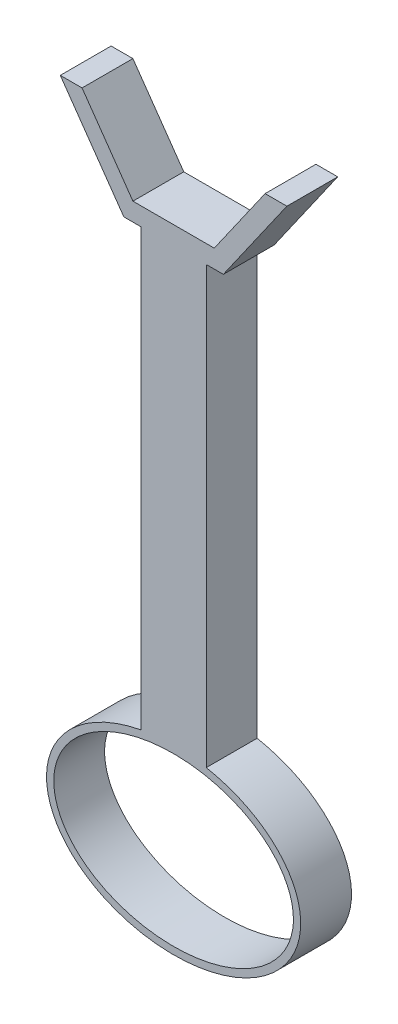
ISO-10303-21;
HEADER;
FILE_DESCRIPTION(('STEP AP214'),'2;1');
FILE_NAME('part.step','',(''),(''),'','','');
FILE_SCHEMA(('AUTOMOTIVE_DESIGN { 1 0 10303 214 1 1 1 1 }'));
ENDSEC;
DATA;
#1=APPLICATION_CONTEXT('core data for automotive mechanical design processes');
#2=APPLICATION_PROTOCOL_DEFINITION('international standard','automotive_design',2000,#1);
#3=PRODUCT_CONTEXT('',#1,'mechanical');
#4=PRODUCT('Part','Part','',(#3));
#5=PRODUCT_RELATED_PRODUCT_CATEGORY('part','',(#4));
#6=PRODUCT_DEFINITION_FORMATION('','',#4);
#7=PRODUCT_DEFINITION_CONTEXT('part definition',#1,'design');
#8=PRODUCT_DEFINITION('design','',#6,#7);
#9=PRODUCT_DEFINITION_SHAPE('','',#8);
#10=(LENGTH_UNIT() NAMED_UNIT(*) SI_UNIT(.MILLI.,.METRE.));
#11=(NAMED_UNIT(*) PLANE_ANGLE_UNIT() SI_UNIT($,.RADIAN.));
#12=(NAMED_UNIT(*) SI_UNIT($,.STERADIAN.) SOLID_ANGLE_UNIT());
#13=UNCERTAINTY_MEASURE_WITH_UNIT(LENGTH_MEASURE(1.E-05),#10,'distance_accuracy_value','');
#14=(GEOMETRIC_REPRESENTATION_CONTEXT(3) GLOBAL_UNCERTAINTY_ASSIGNED_CONTEXT((#13)) GLOBAL_UNIT_ASSIGNED_CONTEXT((#10,
#11,#12)) REPRESENTATION_CONTEXT('',''));
#15=CARTESIAN_POINT('',(0.,0.,0.));
#16=DIRECTION('',(0.,0.,1.));
#17=DIRECTION('',(1.,0.,0.));
#18=AXIS2_PLACEMENT_3D('',#15,#16,#17);
#19=CARTESIAN_POINT('',(-10.2239295190365,0.,7.));
#20=DIRECTION('',(1.,0.,0.));
#21=DIRECTION('',(0.,0.,-1.));
#22=AXIS2_PLACEMENT_3D('',#19,#20,#21);
#23=PLANE('',#22);
#24=DIRECTION('',(0.,-1.,0.));
#25=VECTOR('',#24,1.);
#26=CARTESIAN_POINT('',(-10.2239295190365,0.,0.));
#27=LINE('',#26,#25);
#28=CARTESIAN_POINT('',(-10.2239295190365,11.8416238441167,0.));
#29=VERTEX_POINT('',#28);
#30=CARTESIAN_POINT('',(-10.2239295190365,-48.1583761558833,0.));
#31=VERTEX_POINT('',#30);
#32=EDGE_CURVE('E161',#29,#31,#27,.T.);
#33=ORIENTED_EDGE('',*,*,#32,.T.);
#34=DIRECTION('',(0.,0.,-1.));
#35=VECTOR('',#34,1.);
#36=CARTESIAN_POINT('',(-10.2239295190365,-48.1583761558833,7.));
#37=LINE('',#36,#35);
#38=CARTESIAN_POINT('',(-10.2239295190365,-48.1583761558833,7.));
#39=VERTEX_POINT('',#38);
#40=EDGE_CURVE('E11',#39,#31,#37,.T.);
#41=ORIENTED_EDGE('',*,*,#40,.F.);
#42=DIRECTION('',(0.,-1.,0.));
#43=VECTOR('',#42,1.);
#44=CARTESIAN_POINT('',(-10.2239295190365,0.,7.));
#45=LINE('',#44,#43);
#46=CARTESIAN_POINT('',(-10.2239295190365,11.8416238441167,7.));
#47=VERTEX_POINT('',#46);
#48=EDGE_CURVE('E209',#47,#39,#45,.T.);
#49=ORIENTED_EDGE('',*,*,#48,.F.);
#50=DIRECTION('',(0.,0.,-1.));
#51=VECTOR('',#50,1.);
#52=CARTESIAN_POINT('',(-10.2239295190365,11.8416238441167,7.));
#53=LINE('',#52,#51);
#54=EDGE_CURVE('E49',#47,#29,#53,.T.);
#55=ORIENTED_EDGE('',*,*,#54,.T.);
#56=EDGE_LOOP('',(#33,#41,#49,#55));
#57=FACE_BOUND('',#56,.T.);
#58=ADVANCED_FACE('F33',(#57),#23,.F.);
#59=CARTESIAN_POINT('',(-5.72392951903651,-60.238043673946,7.));
#60=DIRECTION('',(0.,0.,1.));
#61=DIRECTION('',(-1.,0.,0.));
#62=AXIS2_PLACEMENT_3D('',#59,#60,#61);
#63=ELLIPSE('',#62,17.5,12.5);
#64=DIRECTION('',(0.,0.,-1.));
#65=VECTOR('',#64,1.);
#66=SURFACE_OF_LINEAR_EXTRUSION('',#63,#65);
#67=CARTESIAN_POINT('',(-5.72392951903651,-60.238043673946,0.));
#68=DIRECTION('',(0.,0.,1.));
#69=DIRECTION('',(-1.,0.,0.));
#70=AXIS2_PLACEMENT_3D('',#67,#68,#69);
#71=ELLIPSE('',#70,17.5,12.5);
#72=CARTESIAN_POINT('',(-1.22392951903651,-48.1583761558833,0.));
#73=VERTEX_POINT('',#72);
#74=EDGE_CURVE('E254',#31,#73,#71,.T.);
#75=ORIENTED_EDGE('',*,*,#74,.T.);
#76=DIRECTION('',(0.,0.,-1.));
#77=VECTOR('',#76,1.);
#78=CARTESIAN_POINT('',(-1.22392951903651,-48.1583761558833,7.));
#79=LINE('',#78,#77);
#80=CARTESIAN_POINT('',(-1.22392951903651,-48.1583761558833,7.));
#81=VERTEX_POINT('',#80);
#82=EDGE_CURVE('E41',#81,#73,#79,.T.);
#83=ORIENTED_EDGE('',*,*,#82,.F.);
#84=EDGE_CURVE('E99',#39,#81,#63,.T.);
#85=ORIENTED_EDGE('',*,*,#84,.F.);
#86=ORIENTED_EDGE('',*,*,#40,.T.);
#87=EDGE_LOOP('',(#75,#83,#85,#86));
#88=FACE_BOUND('',#87,.T.);
#89=ADVANCED_FACE('F201',(#88),#66,.F.);
#90=CARTESIAN_POINT('',(-1.22392951903651,0.,7.));
#91=DIRECTION('',(-1.,0.,0.));
#92=DIRECTION('',(0.,0.,1.));
#93=AXIS2_PLACEMENT_3D('',#90,#91,#92);
#94=PLANE('',#93);
#95=DIRECTION('',(0.,1.,0.));
#96=VECTOR('',#95,1.);
#97=CARTESIAN_POINT('',(-1.22392951903651,0.,0.));
#98=LINE('',#97,#96);
#99=CARTESIAN_POINT('',(-1.22392951903651,11.8416238441167,0.));
#100=VERTEX_POINT('',#99);
#101=EDGE_CURVE('E250',#73,#100,#98,.T.);
#102=ORIENTED_EDGE('',*,*,#101,.T.);
#103=DIRECTION('',(0.,0.,-1.));
#104=VECTOR('',#103,1.);
#105=CARTESIAN_POINT('',(-1.22392951903651,11.8416238441167,7.));
#106=LINE('',#105,#104);
#107=CARTESIAN_POINT('',(-1.22392951903651,11.8416238441167,7.));
#108=VERTEX_POINT('',#107);
#109=EDGE_CURVE('E244',#108,#100,#106,.T.);
#110=ORIENTED_EDGE('',*,*,#109,.F.);
#111=DIRECTION('',(0.,1.,0.));
#112=VECTOR('',#111,1.);
#113=CARTESIAN_POINT('',(-1.22392951903651,0.,7.));
#114=LINE('',#113,#112);
#115=EDGE_CURVE('E208',#81,#108,#114,.T.);
#116=ORIENTED_EDGE('',*,*,#115,.F.);
#117=ORIENTED_EDGE('',*,*,#82,.T.);
#118=EDGE_LOOP('',(#102,#110,#116,#117));
#119=FACE_BOUND('',#118,.T.);
#120=ADVANCED_FACE('F199',(#119),#94,.F.);
#121=CARTESIAN_POINT('',(0.,11.8416238441167,7.));
#122=DIRECTION('',(0.,-1.,0.));
#123=DIRECTION('',(1.,0.,0.));
#124=AXIS2_PLACEMENT_3D('',#121,#122,#123);
#125=PLANE('',#124);
#126=DIRECTION('',(-1.,0.,0.));
#127=VECTOR('',#126,1.);
#128=CARTESIAN_POINT('',(0.,11.8416238441167,0.));
#129=LINE('',#128,#127);
#130=CARTESIAN_POINT('',(1.12620181793054,11.8416238441167,0.));
#131=VERTEX_POINT('',#130);
#132=EDGE_CURVE('E257',#131,#100,#129,.T.);
#133=ORIENTED_EDGE('',*,*,#132,.F.);
#134=DIRECTION('',(0.,0.,-1.));
#135=VECTOR('',#134,1.);
#136=CARTESIAN_POINT('',(1.12620181793054,11.8416238441167,7.));
#137=LINE('',#136,#135);
#138=CARTESIAN_POINT('',(1.12620181793054,11.8416238441167,7.));
#139=VERTEX_POINT('',#138);
#140=EDGE_CURVE('E242',#139,#131,#137,.T.);
#141=ORIENTED_EDGE('',*,*,#140,.F.);
#142=DIRECTION('',(-1.,0.,0.));
#143=VECTOR('',#142,1.);
#144=CARTESIAN_POINT('',(0.,11.8416238441167,7.));
#145=LINE('',#144,#143);
#146=EDGE_CURVE('E155',#139,#108,#145,.T.);
#147=ORIENTED_EDGE('',*,*,#146,.T.);
#148=ORIENTED_EDGE('',*,*,#109,.T.);
#149=EDGE_LOOP('',(#133,#141,#147,#148));
#150=FACE_BOUND('',#149,.T.);
#151=ADVANCED_FACE('F174',(#150),#125,.T.);
#152=CARTESIAN_POINT('',(-4.80715860588804,3.36475848106905,7.));
#153=DIRECTION('',(0.819252139785348,-0.573433458613227,0.));
#154=DIRECTION('',(0.573433458613227,0.819252139785348,0.));
#155=AXIS2_PLACEMENT_3D('',#152,#153,#154);
#156=PLANE('',#155);
#157=DIRECTION('',(-0.573433458613227,-0.819252139785348,0.));
#158=VECTOR('',#157,1.);
#159=CARTESIAN_POINT('',(-4.80715860588804,3.36475848106905,0.));
#160=LINE('',#159,#158);
#161=CARTESIAN_POINT('',(9.877693010631,24.3446924708958,0.));
#162=VERTEX_POINT('',#161);
#163=EDGE_CURVE('E259',#162,#131,#160,.T.);
#164=ORIENTED_EDGE('',*,*,#163,.F.);
#165=DIRECTION('',(0.,0.,-1.));
#166=VECTOR('',#165,1.);
#167=CARTESIAN_POINT('',(9.877693010631,24.3446924708958,7.));
#168=LINE('',#167,#166);
#169=CARTESIAN_POINT('',(9.877693010631,24.3446924708958,7.));
#170=VERTEX_POINT('',#169);
#171=EDGE_CURVE('E236',#170,#162,#168,.T.);
#172=ORIENTED_EDGE('',*,*,#171,.F.);
#173=DIRECTION('',(-0.573433458613227,-0.819252139785348,0.));
#174=VECTOR('',#173,1.);
#175=CARTESIAN_POINT('',(-4.80715860588804,3.36475848106905,7.));
#176=LINE('',#175,#174);
#177=EDGE_CURVE('E212',#170,#139,#176,.T.);
#178=ORIENTED_EDGE('',*,*,#177,.T.);
#179=ORIENTED_EDGE('',*,*,#140,.T.);
#180=EDGE_LOOP('',(#164,#172,#178,#179));
#181=FACE_BOUND('',#180,.T.);
#182=ADVANCED_FACE('F194',(#181),#156,.T.);
#183=CARTESIAN_POINT('',(0.,24.3446924708958,7.));
#184=DIRECTION('',(0.,1.,0.));
#185=DIRECTION('',(0.,0.,1.));
#186=AXIS2_PLACEMENT_3D('',#183,#184,#185);
#187=PLANE('',#186);
#188=DIRECTION('',(1.,0.,0.));
#189=VECTOR('',#188,1.);
#190=CARTESIAN_POINT('',(0.,24.3446924708958,0.));
#191=LINE('',#190,#189);
#192=CARTESIAN_POINT('',(6.877693010631,24.3446924708958,0.));
#193=VERTEX_POINT('',#192);
#194=EDGE_CURVE('E264',#193,#162,#191,.T.);
#195=ORIENTED_EDGE('',*,*,#194,.F.);
#196=DIRECTION('',(0.,0.,-1.));
#197=VECTOR('',#196,1.);
#198=CARTESIAN_POINT('',(6.877693010631,24.3446924708958,7.));
#199=LINE('',#198,#197);
#200=CARTESIAN_POINT('',(6.877693010631,24.3446924708958,7.));
#201=VERTEX_POINT('',#200);
#202=EDGE_CURVE('E230',#201,#193,#199,.T.);
#203=ORIENTED_EDGE('',*,*,#202,.F.);
#204=DIRECTION('',(1.,0.,0.));
#205=VECTOR('',#204,1.);
#206=CARTESIAN_POINT('',(0.,24.3446924708958,7.));
#207=LINE('',#206,#205);
#208=EDGE_CURVE('E215',#201,#170,#207,.T.);
#209=ORIENTED_EDGE('',*,*,#208,.T.);
#210=ORIENTED_EDGE('',*,*,#171,.T.);
#211=EDGE_LOOP('',(#195,#203,#209,#210));
#212=FACE_BOUND('',#211,.T.);
#213=ADVANCED_FACE('F190',(#212),#187,.T.);
#214=CARTESIAN_POINT('',(-6.82068081151665,4.77411824504924,7.));
#215=DIRECTION('',(-0.819252139785348,0.573433458613227,0.));
#216=DIRECTION('',(-0.573433458613227,-0.819252139785348,0.));
#217=AXIS2_PLACEMENT_3D('',#214,#215,#216);
#218=PLANE('',#217);
#219=DIRECTION('',(0.573433458613227,0.819252139785348,0.));
#220=VECTOR('',#219,1.);
#221=CARTESIAN_POINT('',(-6.82068081151665,4.77411824504924,0.));
#222=LINE('',#221,#220);
#223=CARTESIAN_POINT('',(-0.123929519036503,14.3416238441167,0.));
#224=VERTEX_POINT('',#223);
#225=EDGE_CURVE('E233',#224,#193,#222,.T.);
#226=ORIENTED_EDGE('',*,*,#225,.F.);
#227=DIRECTION('',(0.,0.,-1.));
#228=VECTOR('',#227,1.);
#229=CARTESIAN_POINT('',(-0.123929519036503,14.3416238441167,7.));
#230=LINE('',#229,#228);
#231=CARTESIAN_POINT('',(-0.123929519036503,14.3416238441167,7.));
#232=VERTEX_POINT('',#231);
#233=EDGE_CURVE('E224',#232,#224,#230,.T.);
#234=ORIENTED_EDGE('',*,*,#233,.F.);
#235=DIRECTION('',(0.573433458613227,0.819252139785348,0.));
#236=VECTOR('',#235,1.);
#237=CARTESIAN_POINT('',(-6.82068081151665,4.77411824504924,7.));
#238=LINE('',#237,#236);
#239=EDGE_CURVE('E218',#232,#201,#238,.T.);
#240=ORIENTED_EDGE('',*,*,#239,.T.);
#241=ORIENTED_EDGE('',*,*,#202,.T.);
#242=EDGE_LOOP('',(#226,#234,#240,#241));
#243=FACE_BOUND('',#242,.T.);
#244=ADVANCED_FACE('F186',(#243),#218,.T.);
#245=CARTESIAN_POINT('',(0.,14.3416238441167,7.));
#246=DIRECTION('',(0.,1.,0.));
#247=DIRECTION('',(-1.,0.,0.));
#248=AXIS2_PLACEMENT_3D('',#245,#246,#247);
#249=PLANE('',#248);
#250=DIRECTION('',(1.,0.,0.));
#251=VECTOR('',#250,1.);
#252=CARTESIAN_POINT('',(0.,14.3416238441167,0.));
#253=LINE('',#252,#251);
#254=CARTESIAN_POINT('',(-11.3239295190365,14.3416238441167,0.));
#255=VERTEX_POINT('',#254);
#256=EDGE_CURVE('E268',#255,#224,#253,.T.);
#257=ORIENTED_EDGE('',*,*,#256,.F.);
#258=DIRECTION('',(0.,0.,-1.));
#259=VECTOR('',#258,1.);
#260=CARTESIAN_POINT('',(-11.3239295190365,14.3416238441167,7.));
#261=LINE('',#260,#259);
#262=CARTESIAN_POINT('',(-11.3239295190365,14.3416238441167,7.));
#263=VERTEX_POINT('',#262);
#264=EDGE_CURVE('E226',#263,#255,#261,.T.);
#265=ORIENTED_EDGE('',*,*,#264,.F.);
#266=DIRECTION('',(1.,0.,0.));
#267=VECTOR('',#266,1.);
#268=CARTESIAN_POINT('',(0.,14.3416238441167,7.));
#269=LINE('',#268,#267);
#270=EDGE_CURVE('E221',#263,#232,#269,.T.);
#271=ORIENTED_EDGE('',*,*,#270,.T.);
#272=ORIENTED_EDGE('',*,*,#233,.T.);
#273=EDGE_LOOP('',(#257,#265,#271,#272));
#274=FACE_BOUND('',#273,.T.);
#275=ADVANCED_FACE('F182',(#274),#249,.T.);
#276=CARTESIAN_POINT('',(-0.862825315171977,-0.603932392276398,7.));
#277=DIRECTION('',(-0.819252139785344,-0.573433458613234,0.));
#278=DIRECTION('',(0.573433458613234,-0.819252139785344,0.));
#279=AXIS2_PLACEMENT_3D('',#276,#277,#278);
#280=PLANE('',#279);
#281=DIRECTION('',(-0.573433458613234,0.819252139785344,0.));
#282=VECTOR('',#281,1.);
#283=CARTESIAN_POINT('',(-0.862825315171977,-0.603932392276398,0.));
#284=LINE('',#283,#282);
#285=CARTESIAN_POINT('',(-18.3255520487041,24.3446924708957,0.));
#286=VERTEX_POINT('',#285);
#287=EDGE_CURVE('E270',#255,#286,#284,.T.);
#288=ORIENTED_EDGE('',*,*,#287,.T.);
#289=DIRECTION('',(0.,0.,-1.));
#290=VECTOR('',#289,1.);
#291=CARTESIAN_POINT('',(-18.3255520487041,24.3446924708957,7.));
#292=LINE('',#291,#290);
#293=CARTESIAN_POINT('',(-18.3255520487041,24.3446924708957,7.));
#294=VERTEX_POINT('',#293);
#295=EDGE_CURVE('E148',#294,#286,#292,.T.);
#296=ORIENTED_EDGE('',*,*,#295,.F.);
#297=DIRECTION('',(-0.573433458613234,0.819252139785344,0.));
#298=VECTOR('',#297,1.);
#299=CARTESIAN_POINT('',(-0.862825315171977,-0.603932392276398,7.));
#300=LINE('',#299,#298);
#301=EDGE_CURVE('E136',#263,#294,#300,.T.);
#302=ORIENTED_EDGE('',*,*,#301,.F.);
#303=ORIENTED_EDGE('',*,*,#264,.T.);
#304=EDGE_LOOP('',(#288,#296,#302,#303));
#305=FACE_BOUND('',#304,.T.);
#306=ADVANCED_FACE('F179',(#305),#280,.F.);
#307=CARTESIAN_POINT('',(0.,24.3446924708957,7.));
#308=DIRECTION('',(0.,-1.,0.));
#309=DIRECTION('',(1.,0.,0.));
#310=AXIS2_PLACEMENT_3D('',#307,#308,#309);
#311=PLANE('',#310);
#312=DIRECTION('',(-1.,0.,0.));
#313=VECTOR('',#312,1.);
#314=CARTESIAN_POINT('',(0.,24.3446924708957,0.));
#315=LINE('',#314,#313);
#316=CARTESIAN_POINT('',(-21.3255520487041,24.3446924708957,0.));
#317=VERTEX_POINT('',#316);
#318=EDGE_CURVE('E145',#286,#317,#315,.T.);
#319=ORIENTED_EDGE('',*,*,#318,.T.);
#320=DIRECTION('',(0.,0.,-1.));
#321=VECTOR('',#320,1.);
#322=CARTESIAN_POINT('',(-21.3255520487041,24.3446924708957,7.));
#323=LINE('',#322,#321);
#324=CARTESIAN_POINT('',(-21.3255520487041,24.3446924708957,7.));
#325=VERTEX_POINT('',#324);
#326=EDGE_CURVE('E142',#325,#317,#323,.T.);
#327=ORIENTED_EDGE('',*,*,#326,.F.);
#328=DIRECTION('',(-1.,0.,0.));
#329=VECTOR('',#328,1.);
#330=CARTESIAN_POINT('',(0.,24.3446924708957,7.));
#331=LINE('',#330,#329);
#332=EDGE_CURVE('E127',#294,#325,#331,.T.);
#333=ORIENTED_EDGE('',*,*,#332,.F.);
#334=ORIENTED_EDGE('',*,*,#295,.T.);
#335=EDGE_LOOP('',(#319,#327,#333,#334));
#336=FACE_BOUND('',#335,.T.);
#337=ADVANCED_FACE('F143',(#336),#311,.F.);
#338=CARTESIAN_POINT('',(-2.87634752080057,-2.01329215625661,7.));
#339=DIRECTION('',(-0.819252139785344,-0.573433458613234,0.));
#340=DIRECTION('',(0.573433458613234,-0.819252139785344,0.));
#341=AXIS2_PLACEMENT_3D('',#338,#339,#340);
#342=PLANE('',#341);
#343=DIRECTION('',(-0.573433458613234,0.819252139785344,0.));
#344=VECTOR('',#343,1.);
#345=CARTESIAN_POINT('',(-2.87634752080057,-2.01329215625661,0.));
#346=LINE('',#345,#344);
#347=CARTESIAN_POINT('',(-12.5740608560035,11.8416238441167,0.));
#348=VERTEX_POINT('',#347);
#349=EDGE_CURVE('E273',#348,#317,#346,.T.);
#350=ORIENTED_EDGE('',*,*,#349,.F.);
#351=DIRECTION('',(0.,0.,-1.));
#352=VECTOR('',#351,1.);
#353=CARTESIAN_POINT('',(-12.5740608560035,11.8416238441167,7.));
#354=LINE('',#353,#352);
#355=CARTESIAN_POINT('',(-12.5740608560035,11.8416238441167,7.));
#356=VERTEX_POINT('',#355);
#357=EDGE_CURVE('E87',#356,#348,#354,.T.);
#358=ORIENTED_EDGE('',*,*,#357,.F.);
#359=DIRECTION('',(-0.573433458613234,0.819252139785344,0.));
#360=VECTOR('',#359,1.);
#361=CARTESIAN_POINT('',(-2.87634752080057,-2.01329215625661,7.));
#362=LINE('',#361,#360);
#363=EDGE_CURVE('E133',#356,#325,#362,.T.);
#364=ORIENTED_EDGE('',*,*,#363,.T.);
#365=ORIENTED_EDGE('',*,*,#326,.T.);
#366=EDGE_LOOP('',(#350,#358,#364,#365));
#367=FACE_BOUND('',#366,.T.);
#368=ADVANCED_FACE('F150',(#367),#342,.T.);
#369=EDGE_CURVE('E261',#29,#348,#129,.T.);
#370=ORIENTED_EDGE('',*,*,#369,.F.);
#371=ORIENTED_EDGE('',*,*,#54,.F.);
#372=EDGE_CURVE('E151',#47,#356,#145,.T.);
#373=ORIENTED_EDGE('',*,*,#372,.T.);
#374=ORIENTED_EDGE('',*,*,#357,.T.);
#375=EDGE_LOOP('',(#370,#371,#373,#374));
#376=FACE_BOUND('',#375,.T.);
#377=ADVANCED_FACE('F168',(#376),#125,.T.);
#378=CARTESIAN_POINT('',(-5.72392951903651,-60.238043673946,7.));
#379=DIRECTION('',(0.,0.,1.));
#380=DIRECTION('',(1.,0.,0.));
#381=AXIS2_PLACEMENT_3D('',#378,#379,#380);
#382=ELLIPSE('',#381,16.5,11.5);
#383=DIRECTION('',(0.,0.,-1.));
#384=VECTOR('',#383,1.);
#385=SURFACE_OF_LINEAR_EXTRUSION('',#382,#384);
#386=CARTESIAN_POINT('',(10.7760704809635,-60.238043673946,7.));
#387=VERTEX_POINT('',#386);
#388=EDGE_CURVE('E153',#387,#387,#382,.T.);
#389=ORIENTED_EDGE('',*,*,#388,.T.);
#390=EDGE_LOOP('',(#389));
#391=FACE_BOUND('',#390,.T.);
#392=CARTESIAN_POINT('',(-5.72392951903651,-60.238043673946,0.));
#393=DIRECTION('',(0.,0.,1.));
#394=DIRECTION('',(1.,0.,0.));
#395=AXIS2_PLACEMENT_3D('',#392,#393,#394);
#396=ELLIPSE('',#395,16.5,11.5);
#397=CARTESIAN_POINT('',(10.7760704809635,-60.238043673946,0.));
#398=VERTEX_POINT('',#397);
#399=EDGE_CURVE('E275',#398,#398,#396,.T.);
#400=ORIENTED_EDGE('',*,*,#399,.F.);
#401=EDGE_LOOP('',(#400));
#402=FACE_BOUND('',#401,.T.);
#403=ADVANCED_FACE('F164',(#391,#402),#385,.T.);
#404=CARTESIAN_POINT('',(0.,0.,7.));
#405=DIRECTION('',(0.,0.,1.));
#406=DIRECTION('',(1.,0.,0.));
#407=AXIS2_PLACEMENT_3D('',#404,#405,#406);
#408=PLANE('',#407);
#409=ORIENTED_EDGE('',*,*,#48,.T.);
#410=ORIENTED_EDGE('',*,*,#84,.T.);
#411=ORIENTED_EDGE('',*,*,#115,.T.);
#412=ORIENTED_EDGE('',*,*,#146,.F.);
#413=ORIENTED_EDGE('',*,*,#177,.F.);
#414=ORIENTED_EDGE('',*,*,#208,.F.);
#415=ORIENTED_EDGE('',*,*,#239,.F.);
#416=ORIENTED_EDGE('',*,*,#270,.F.);
#417=ORIENTED_EDGE('',*,*,#301,.T.);
#418=ORIENTED_EDGE('',*,*,#332,.T.);
#419=ORIENTED_EDGE('',*,*,#363,.F.);
#420=ORIENTED_EDGE('',*,*,#372,.F.);
#421=EDGE_LOOP('',(#409,#410,#411,#412,#413,#414,#415,#416,#417,#418,#419,#420));
#422=FACE_BOUND('',#421,.T.);
#423=ORIENTED_EDGE('',*,*,#388,.F.);
#424=EDGE_LOOP('',(#423));
#425=FACE_BOUND('',#424,.T.);
#426=ADVANCED_FACE('F129',(#422,#425),#408,.T.);
#427=CARTESIAN_POINT('',(0.,0.,0.));
#428=DIRECTION('',(0.,0.,1.));
#429=DIRECTION('',(1.,0.,0.));
#430=AXIS2_PLACEMENT_3D('',#427,#428,#429);
#431=PLANE('',#430);
#432=ORIENTED_EDGE('',*,*,#32,.F.);
#433=ORIENTED_EDGE('',*,*,#369,.T.);
#434=ORIENTED_EDGE('',*,*,#349,.T.);
#435=ORIENTED_EDGE('',*,*,#318,.F.);
#436=ORIENTED_EDGE('',*,*,#287,.F.);
#437=ORIENTED_EDGE('',*,*,#256,.T.);
#438=ORIENTED_EDGE('',*,*,#225,.T.);
#439=ORIENTED_EDGE('',*,*,#194,.T.);
#440=ORIENTED_EDGE('',*,*,#163,.T.);
#441=ORIENTED_EDGE('',*,*,#132,.T.);
#442=ORIENTED_EDGE('',*,*,#101,.F.);
#443=ORIENTED_EDGE('',*,*,#74,.F.);
#444=EDGE_LOOP('',(#432,#433,#434,#435,#436,#437,#438,#439,#440,#441,#442,#443));
#445=FACE_BOUND('',#444,.T.);
#446=ORIENTED_EDGE('',*,*,#399,.T.);
#447=EDGE_LOOP('',(#446));
#448=FACE_BOUND('',#447,.T.);
#449=ADVANCED_FACE('F170',(#445,#448),#431,.F.);
#450=CLOSED_SHELL('',(#58,#89,#120,#151,#182,#213,#244,#275,#306,#337,#368,#377,#403,#426,#449));
#451=MANIFOLD_SOLID_BREP('B2',#450);
#452=ADVANCED_BREP_SHAPE_REPRESENTATION('',(#18,#451),#14);
#453=SHAPE_DEFINITION_REPRESENTATION(#9,#452);
ENDSEC;
END-ISO-10303-21;
